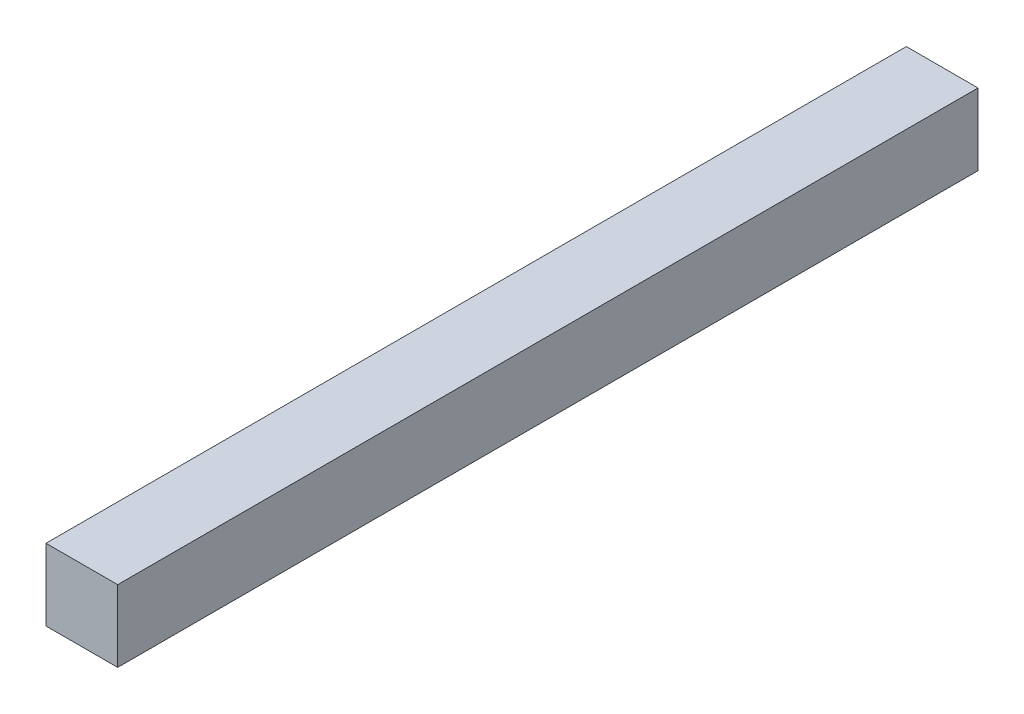
ISO-10303-21;
HEADER;
FILE_DESCRIPTION(('STEP AP214'),'2;1');
FILE_NAME('part.step','',(''),(''),'','','');
FILE_SCHEMA(('AUTOMOTIVE_DESIGN { 1 0 10303 214 1 1 1 1 }'));
ENDSEC;
DATA;
#1=APPLICATION_CONTEXT('core data for automotive mechanical design processes');
#2=APPLICATION_PROTOCOL_DEFINITION('international standard','automotive_design',2000,#1);
#3=PRODUCT_CONTEXT('',#1,'mechanical');
#4=PRODUCT('Part','Part','',(#3));
#5=PRODUCT_RELATED_PRODUCT_CATEGORY('part','',(#4));
#6=PRODUCT_DEFINITION_FORMATION('','',#4);
#7=PRODUCT_DEFINITION_CONTEXT('part definition',#1,'design');
#8=PRODUCT_DEFINITION('design','',#6,#7);
#9=PRODUCT_DEFINITION_SHAPE('','',#8);
#10=(LENGTH_UNIT() NAMED_UNIT(*) SI_UNIT(.MILLI.,.METRE.));
#11=(NAMED_UNIT(*) PLANE_ANGLE_UNIT() SI_UNIT($,.RADIAN.));
#12=(NAMED_UNIT(*) SI_UNIT($,.STERADIAN.) SOLID_ANGLE_UNIT());
#13=UNCERTAINTY_MEASURE_WITH_UNIT(LENGTH_MEASURE(1.E-05),#10,'distance_accuracy_value','');
#14=(GEOMETRIC_REPRESENTATION_CONTEXT(3) GLOBAL_UNCERTAINTY_ASSIGNED_CONTEXT((#13)) GLOBAL_UNIT_ASSIGNED_CONTEXT((#10,
#11,#12)) REPRESENTATION_CONTEXT('',''));
#15=CARTESIAN_POINT('',(0.,0.,0.));
#16=DIRECTION('',(0.,0.,1.));
#17=DIRECTION('',(1.,0.,0.));
#18=AXIS2_PLACEMENT_3D('',#15,#16,#17);
#19=CARTESIAN_POINT('',(-66.4481711918606,23.9811377863196,600.));
#20=DIRECTION('',(1.,0.,0.));
#21=DIRECTION('',(0.,0.,-1.));
#22=AXIS2_PLACEMENT_3D('',#19,#20,#21);
#23=PLANE('',#22);
#24=DIRECTION('',(0.,-1.,0.));
#25=VECTOR('',#24,1.);
#26=CARTESIAN_POINT('',(-66.4481711918606,23.9811377863196,0.));
#27=LINE('',#26,#25);
#28=CARTESIAN_POINT('',(-66.4481711918606,23.9811377863196,0.));
#29=VERTEX_POINT('',#28);
#30=CARTESIAN_POINT('',(-66.4481711918606,-26.0188622136804,0.));
#31=VERTEX_POINT('',#30);
#32=EDGE_CURVE('E107',#29,#31,#27,.T.);
#33=ORIENTED_EDGE('',*,*,#32,.T.);
#34=DIRECTION('',(0.,0.,-1.));
#35=VECTOR('',#34,1.);
#36=CARTESIAN_POINT('',(-66.4481711918606,-26.0188622136804,600.));
#37=LINE('',#36,#35);
#38=CARTESIAN_POINT('',(-66.4481711918606,-26.0188622136804,600.));
#39=VERTEX_POINT('',#38);
#40=EDGE_CURVE('E11',#39,#31,#37,.T.);
#41=ORIENTED_EDGE('',*,*,#40,.F.);
#42=DIRECTION('',(0.,-1.,0.));
#43=VECTOR('',#42,1.);
#44=CARTESIAN_POINT('',(-66.4481711918606,23.9811377863196,600.));
#45=LINE('',#44,#43);
#46=CARTESIAN_POINT('',(-66.4481711918606,23.9811377863196,600.));
#47=VERTEX_POINT('',#46);
#48=EDGE_CURVE('E91',#47,#39,#45,.T.);
#49=ORIENTED_EDGE('',*,*,#48,.F.);
#50=DIRECTION('',(0.,0.,-1.));
#51=VECTOR('',#50,1.);
#52=CARTESIAN_POINT('',(-66.4481711918606,23.9811377863196,600.));
#53=LINE('',#52,#51);
#54=EDGE_CURVE('E103',#47,#29,#53,.T.);
#55=ORIENTED_EDGE('',*,*,#54,.T.);
#56=EDGE_LOOP('',(#33,#41,#49,#55));
#57=FACE_BOUND('',#56,.T.);
#58=ADVANCED_FACE('F39',(#57),#23,.F.);
#59=CARTESIAN_POINT('',(-66.4481711918606,-26.0188622136804,600.));
#60=DIRECTION('',(0.,1.,0.));
#61=DIRECTION('',(0.,0.,1.));
#62=AXIS2_PLACEMENT_3D('',#59,#60,#61);
#63=PLANE('',#62);
#64=DIRECTION('',(1.,0.,0.));
#65=VECTOR('',#64,1.);
#66=CARTESIAN_POINT('',(-66.4481711918606,-26.0188622136804,0.));
#67=LINE('',#66,#65);
#68=CARTESIAN_POINT('',(-16.4481711918606,-26.0188622136804,0.));
#69=VERTEX_POINT('',#68);
#70=EDGE_CURVE('E96',#31,#69,#67,.T.);
#71=ORIENTED_EDGE('',*,*,#70,.T.);
#72=DIRECTION('',(0.,0.,-1.));
#73=VECTOR('',#72,1.);
#74=CARTESIAN_POINT('',(-16.4481711918606,-26.0188622136804,600.));
#75=LINE('',#74,#73);
#76=CARTESIAN_POINT('',(-16.4481711918606,-26.0188622136804,600.));
#77=VERTEX_POINT('',#76);
#78=EDGE_CURVE('E48',#77,#69,#75,.T.);
#79=ORIENTED_EDGE('',*,*,#78,.F.);
#80=DIRECTION('',(1.,0.,0.));
#81=VECTOR('',#80,1.);
#82=CARTESIAN_POINT('',(-66.4481711918606,-26.0188622136804,600.));
#83=LINE('',#82,#81);
#84=EDGE_CURVE('E86',#39,#77,#83,.T.);
#85=ORIENTED_EDGE('',*,*,#84,.F.);
#86=ORIENTED_EDGE('',*,*,#40,.T.);
#87=EDGE_LOOP('',(#71,#79,#85,#86));
#88=FACE_BOUND('',#87,.T.);
#89=ADVANCED_FACE('F95',(#88),#63,.F.);
#90=CARTESIAN_POINT('',(-16.4481711918606,23.9811377863196,600.));
#91=DIRECTION('',(-1.,0.,0.));
#92=DIRECTION('',(0.,0.,1.));
#93=AXIS2_PLACEMENT_3D('',#90,#91,#92);
#94=PLANE('',#93);
#95=DIRECTION('',(0.,1.,0.));
#96=VECTOR('',#95,1.);
#97=CARTESIAN_POINT('',(-16.4481711918606,23.9811377863196,0.));
#98=LINE('',#97,#96);
#99=CARTESIAN_POINT('',(-16.4481711918606,23.9811377863196,0.));
#100=VERTEX_POINT('',#99);
#101=EDGE_CURVE('E73',#69,#100,#98,.T.);
#102=ORIENTED_EDGE('',*,*,#101,.T.);
#103=DIRECTION('',(0.,0.,-1.));
#104=VECTOR('',#103,1.);
#105=CARTESIAN_POINT('',(-16.4481711918606,23.9811377863196,600.));
#106=LINE('',#105,#104);
#107=CARTESIAN_POINT('',(-16.4481711918606,23.9811377863196,600.));
#108=VERTEX_POINT('',#107);
#109=EDGE_CURVE('E98',#108,#100,#106,.T.);
#110=ORIENTED_EDGE('',*,*,#109,.F.);
#111=DIRECTION('',(0.,1.,0.));
#112=VECTOR('',#111,1.);
#113=CARTESIAN_POINT('',(-16.4481711918606,23.9811377863196,600.));
#114=LINE('',#113,#112);
#115=EDGE_CURVE('E89',#77,#108,#114,.T.);
#116=ORIENTED_EDGE('',*,*,#115,.F.);
#117=ORIENTED_EDGE('',*,*,#78,.T.);
#118=EDGE_LOOP('',(#102,#110,#116,#117));
#119=FACE_BOUND('',#118,.T.);
#120=ADVANCED_FACE('F99',(#119),#94,.F.);
#121=CARTESIAN_POINT('',(-66.4481711918606,23.9811377863196,600.));
#122=DIRECTION('',(0.,-1.,0.));
#123=DIRECTION('',(0.,0.,-1.));
#124=AXIS2_PLACEMENT_3D('',#121,#122,#123);
#125=PLANE('',#124);
#126=DIRECTION('',(-1.,0.,0.));
#127=VECTOR('',#126,1.);
#128=CARTESIAN_POINT('',(-66.4481711918606,23.9811377863196,0.));
#129=LINE('',#128,#127);
#130=EDGE_CURVE('E79',#100,#29,#129,.T.);
#131=ORIENTED_EDGE('',*,*,#130,.T.);
#132=ORIENTED_EDGE('',*,*,#54,.F.);
#133=DIRECTION('',(-1.,0.,0.));
#134=VECTOR('',#133,1.);
#135=CARTESIAN_POINT('',(-66.4481711918606,23.9811377863196,600.));
#136=LINE('',#135,#134);
#137=EDGE_CURVE('E56',#108,#47,#136,.T.);
#138=ORIENTED_EDGE('',*,*,#137,.F.);
#139=ORIENTED_EDGE('',*,*,#109,.T.);
#140=EDGE_LOOP('',(#131,#132,#138,#139));
#141=FACE_BOUND('',#140,.T.);
#142=ADVANCED_FACE('F120',(#141),#125,.F.);
#143=CARTESIAN_POINT('',(0.,0.,600.));
#144=DIRECTION('',(0.,0.,1.));
#145=DIRECTION('',(1.,0.,0.));
#146=AXIS2_PLACEMENT_3D('',#143,#144,#145);
#147=PLANE('',#146);
#148=ORIENTED_EDGE('',*,*,#48,.T.);
#149=ORIENTED_EDGE('',*,*,#84,.T.);
#150=ORIENTED_EDGE('',*,*,#115,.T.);
#151=ORIENTED_EDGE('',*,*,#137,.T.);
#152=EDGE_LOOP('',(#148,#149,#150,#151));
#153=FACE_BOUND('',#152,.T.);
#154=ADVANCED_FACE('F87',(#153),#147,.T.);
#155=CARTESIAN_POINT('',(0.,0.,0.));
#156=DIRECTION('',(0.,0.,1.));
#157=DIRECTION('',(1.,0.,0.));
#158=AXIS2_PLACEMENT_3D('',#155,#156,#157);
#159=PLANE('',#158);
#160=ORIENTED_EDGE('',*,*,#32,.F.);
#161=ORIENTED_EDGE('',*,*,#130,.F.);
#162=ORIENTED_EDGE('',*,*,#101,.F.);
#163=ORIENTED_EDGE('',*,*,#70,.F.);
#164=EDGE_LOOP('',(#160,#161,#162,#163));
#165=FACE_BOUND('',#164,.T.);
#166=ADVANCED_FACE('F123',(#165),#159,.F.);
#167=CLOSED_SHELL('',(#58,#89,#120,#142,#154,#166));
#168=MANIFOLD_SOLID_BREP('B2',#167);
#169=ADVANCED_BREP_SHAPE_REPRESENTATION('',(#18,#168),#14);
#170=SHAPE_DEFINITION_REPRESENTATION(#9,#169);
ENDSEC;
END-ISO-10303-21;
